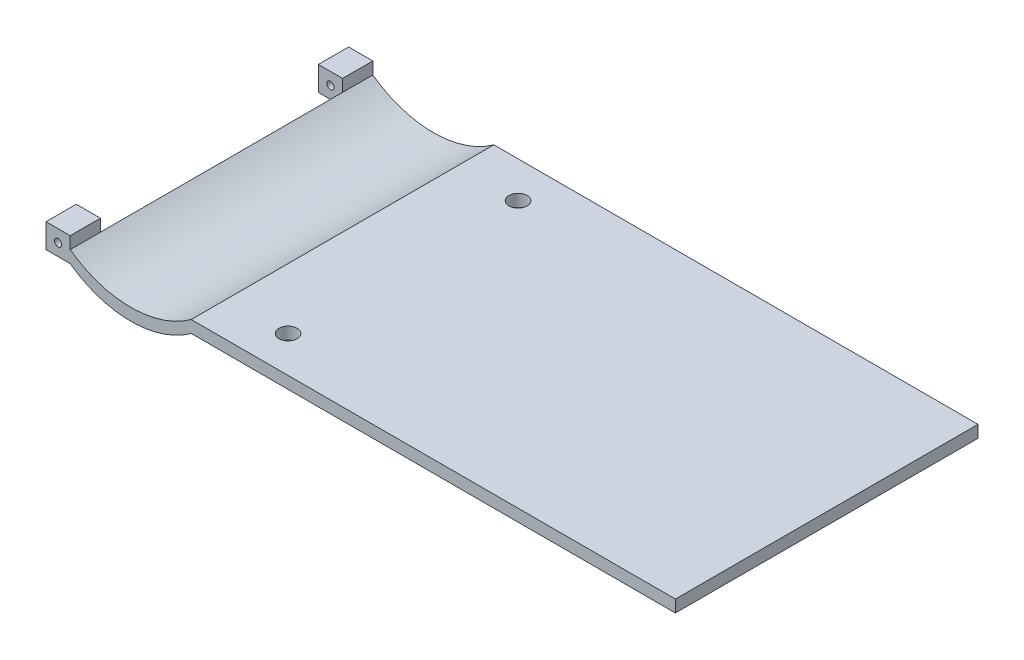
ISO-10303-21;
HEADER;
FILE_DESCRIPTION(('STEP AP214'),'2;1');
FILE_NAME('part.step','',(''),(''),'','','');
FILE_SCHEMA(('AUTOMOTIVE_DESIGN { 1 0 10303 214 1 1 1 1 }'));
ENDSEC;
DATA;
#1=APPLICATION_CONTEXT('core data for automotive mechanical design processes');
#2=APPLICATION_PROTOCOL_DEFINITION('international standard','automotive_design',2000,#1);
#3=PRODUCT_CONTEXT('',#1,'mechanical');
#4=PRODUCT('Part','Part','',(#3));
#5=PRODUCT_RELATED_PRODUCT_CATEGORY('part','',(#4));
#6=PRODUCT_DEFINITION_FORMATION('','',#4);
#7=PRODUCT_DEFINITION_CONTEXT('part definition',#1,'design');
#8=PRODUCT_DEFINITION('design','',#6,#7);
#9=PRODUCT_DEFINITION_SHAPE('','',#8);
#10=(LENGTH_UNIT() NAMED_UNIT(*) SI_UNIT(.MILLI.,.METRE.));
#11=(NAMED_UNIT(*) PLANE_ANGLE_UNIT() SI_UNIT($,.RADIAN.));
#12=(NAMED_UNIT(*) SI_UNIT($,.STERADIAN.) SOLID_ANGLE_UNIT());
#13=UNCERTAINTY_MEASURE_WITH_UNIT(LENGTH_MEASURE(1.E-05),#10,'distance_accuracy_value','');
#14=(GEOMETRIC_REPRESENTATION_CONTEXT(3) GLOBAL_UNCERTAINTY_ASSIGNED_CONTEXT((#13)) GLOBAL_UNIT_ASSIGNED_CONTEXT((#10,
#11,#12)) REPRESENTATION_CONTEXT('',''));
#15=CARTESIAN_POINT('',(0.,0.,0.));
#16=DIRECTION('',(0.,0.,1.));
#17=DIRECTION('',(1.,0.,0.));
#18=AXIS2_PLACEMENT_3D('',#15,#16,#17);
#19=CARTESIAN_POINT('',(-599.999999999995,-826.529608575885,500.));
#20=DIRECTION('',(-1.,0.,0.));
#21=DIRECTION('',(0.,-1.,0.));
#22=AXIS2_PLACEMENT_3D('',#19,#20,#21);
#23=PLANE('',#22);
#24=DIRECTION('',(0.,0.,-1.));
#25=VECTOR('',#24,1.);
#26=CARTESIAN_POINT('',(-600.,9.9999999999999,500.));
#27=LINE('',#26,#25);
#28=CARTESIAN_POINT('',(-600.,9.9999999999999,500.));
#29=VERTEX_POINT('',#28);
#30=CARTESIAN_POINT('',(-600.,9.9999999999999,450.));
#31=VERTEX_POINT('',#30);
#32=EDGE_CURVE('E42',#29,#31,#27,.T.);
#33=ORIENTED_EDGE('',*,*,#32,.T.);
#34=DIRECTION('',(0.,1.,0.));
#35=VECTOR('',#34,1.);
#36=CARTESIAN_POINT('',(-600.,-42.5227291513248,450.));
#37=LINE('',#36,#35);
#38=CARTESIAN_POINT('',(-600.,30.,450.));
#39=VERTEX_POINT('',#38);
#40=EDGE_CURVE('E214',#31,#39,#37,.T.);
#41=ORIENTED_EDGE('',*,*,#40,.T.);
#42=DIRECTION('',(0.,0.,-1.));
#43=VECTOR('',#42,1.);
#44=CARTESIAN_POINT('',(-600.,30.,500.));
#45=LINE('',#44,#43);
#46=CARTESIAN_POINT('',(-600.,30.,500.));
#47=VERTEX_POINT('',#46);
#48=EDGE_CURVE('E194',#47,#39,#45,.T.);
#49=ORIENTED_EDGE('',*,*,#48,.F.);
#50=DIRECTION('',(0.,1.,0.));
#51=VECTOR('',#50,1.);
#52=CARTESIAN_POINT('',(-599.999999999995,-826.529608575885,500.));
#53=LINE('',#52,#51);
#54=EDGE_CURVE('E245',#29,#47,#53,.T.);
#55=ORIENTED_EDGE('',*,*,#54,.F.);
#56=EDGE_LOOP('',(#33,#41,#49,#55));
#57=FACE_BOUND('',#56,.T.);
#58=ADVANCED_FACE('F33',(#57),#23,.F.);
#59=CARTESIAN_POINT('',(-129.99489689484,30.,500.));
#60=DIRECTION('',(0.,-1.,0.));
#61=DIRECTION('',(1.,0.,0.));
#62=AXIS2_PLACEMENT_3D('',#59,#60,#61);
#63=PLANE('',#62);
#64=ORIENTED_EDGE('',*,*,#48,.T.);
#65=DIRECTION('',(1.,0.,0.));
#66=VECTOR('',#65,1.);
#67=CARTESIAN_POINT('',(-600.,30.,450.));
#68=LINE('',#67,#66);
#69=CARTESIAN_POINT('',(-640.,30.,450.));
#70=VERTEX_POINT('',#69);
#71=EDGE_CURVE('E222',#70,#39,#68,.T.);
#72=ORIENTED_EDGE('',*,*,#71,.F.);
#73=DIRECTION('',(0.,0.,-1.));
#74=VECTOR('',#73,1.);
#75=CARTESIAN_POINT('',(-640.,30.,500.));
#76=LINE('',#75,#74);
#77=CARTESIAN_POINT('',(-640.,30.,500.));
#78=VERTEX_POINT('',#77);
#79=EDGE_CURVE('E190',#78,#70,#76,.T.);
#80=ORIENTED_EDGE('',*,*,#79,.F.);
#81=DIRECTION('',(-1.,0.,0.));
#82=VECTOR('',#81,1.);
#83=CARTESIAN_POINT('',(-129.99489689484,30.,500.));
#84=LINE('',#83,#82);
#85=EDGE_CURVE('E247',#47,#78,#84,.T.);
#86=ORIENTED_EDGE('',*,*,#85,.F.);
#87=EDGE_LOOP('',(#64,#72,#80,#86));
#88=FACE_BOUND('',#87,.T.);
#89=ADVANCED_FACE('F318',(#88),#63,.F.);
#90=CARTESIAN_POINT('',(-640.,-826.529608575883,500.));
#91=DIRECTION('',(-1.,0.,0.));
#92=DIRECTION('',(0.,0.,1.));
#93=AXIS2_PLACEMENT_3D('',#90,#91,#92);
#94=PLANE('',#93);
#95=DIRECTION('',(0.,1.,0.));
#96=VECTOR('',#95,1.);
#97=CARTESIAN_POINT('',(-640.,-42.5227291513248,450.));
#98=LINE('',#97,#96);
#99=CARTESIAN_POINT('',(-640.,-10.,450.));
#100=VERTEX_POINT('',#99);
#101=EDGE_CURVE('E219',#100,#70,#98,.T.);
#102=ORIENTED_EDGE('',*,*,#101,.F.);
#103=DIRECTION('',(0.,0.,-1.));
#104=VECTOR('',#103,1.);
#105=CARTESIAN_POINT('',(-640.,-10.,500.));
#106=LINE('',#105,#104);
#107=CARTESIAN_POINT('',(-640.,-10.,500.));
#108=VERTEX_POINT('',#107);
#109=EDGE_CURVE('E186',#108,#100,#106,.T.);
#110=ORIENTED_EDGE('',*,*,#109,.F.);
#111=DIRECTION('',(0.,1.,0.));
#112=VECTOR('',#111,1.);
#113=CARTESIAN_POINT('',(-640.,-826.529608575883,500.));
#114=LINE('',#113,#112);
#115=EDGE_CURVE('E249',#108,#78,#114,.T.);
#116=ORIENTED_EDGE('',*,*,#115,.T.);
#117=ORIENTED_EDGE('',*,*,#79,.T.);
#118=EDGE_LOOP('',(#102,#110,#116,#117));
#119=FACE_BOUND('',#118,.T.);
#120=ADVANCED_FACE('F324',(#119),#94,.T.);
#121=CARTESIAN_POINT('',(-129.99489689484,-10.,500.));
#122=DIRECTION('',(0.,-1.,0.));
#123=DIRECTION('',(1.,0.,0.));
#124=AXIS2_PLACEMENT_3D('',#121,#122,#123);
#125=PLANE('',#124);
#126=DIRECTION('',(-1.,0.,0.));
#127=VECTOR('',#126,1.);
#128=CARTESIAN_POINT('',(-129.99489689484,-10.,450.));
#129=LINE('',#128,#127);
#130=CARTESIAN_POINT('',(-600.,-9.99999999999976,450.));
#131=VERTEX_POINT('',#130);
#132=EDGE_CURVE('E232',#131,#100,#129,.T.);
#133=ORIENTED_EDGE('',*,*,#132,.F.);
#134=DIRECTION('',(0.,0.,-1.));
#135=VECTOR('',#134,1.);
#136=CARTESIAN_POINT('',(-600.,-10.,500.));
#137=LINE('',#136,#135);
#138=CARTESIAN_POINT('',(-600.,-10.,500.));
#139=VERTEX_POINT('',#138);
#140=EDGE_CURVE('E182',#139,#131,#137,.T.);
#141=ORIENTED_EDGE('',*,*,#140,.F.);
#142=DIRECTION('',(-1.,0.,0.));
#143=VECTOR('',#142,1.);
#144=CARTESIAN_POINT('',(-129.99489689484,-10.,500.));
#145=LINE('',#144,#143);
#146=EDGE_CURVE('E129',#139,#108,#145,.T.);
#147=ORIENTED_EDGE('',*,*,#146,.T.);
#148=ORIENTED_EDGE('',*,*,#109,.T.);
#149=EDGE_LOOP('',(#133,#141,#147,#148));
#150=FACE_BOUND('',#149,.T.);
#151=ADVANCED_FACE('F253',(#150),#125,.T.);
#152=CARTESIAN_POINT('',(-620.,9.99999999999993,500.));
#153=DIRECTION('',(0.,0.,-1.));
#154=DIRECTION('',(-1.,0.,0.));
#155=AXIS2_PLACEMENT_3D('',#152,#153,#154);
#156=CYLINDRICAL_SURFACE('',#155,5.99999999999999);
#157=CARTESIAN_POINT('',(-620.,9.99999999999993,450.));
#158=DIRECTION('',(0.,0.,1.));
#159=DIRECTION('',(1.,0.,0.));
#160=AXIS2_PLACEMENT_3D('',#157,#158,#159);
#161=CIRCLE('',#160,5.99999999999999);
#162=CARTESIAN_POINT('',(-614.,9.99999999999993,450.));
#163=VERTEX_POINT('',#162);
#164=EDGE_CURVE('E37',#163,#163,#161,.T.);
#165=ORIENTED_EDGE('',*,*,#164,.F.);
#166=EDGE_LOOP('',(#165));
#167=FACE_BOUND('',#166,.T.);
#168=CARTESIAN_POINT('',(-620.,9.99999999999993,500.));
#169=DIRECTION('',(0.,0.,1.));
#170=DIRECTION('',(1.,0.,0.));
#171=AXIS2_PLACEMENT_3D('',#168,#169,#170);
#172=CIRCLE('',#171,5.99999999999999);
#173=CARTESIAN_POINT('',(-614.,9.99999999999993,500.));
#174=VERTEX_POINT('',#173);
#175=EDGE_CURVE('E147',#174,#174,#172,.T.);
#176=ORIENTED_EDGE('',*,*,#175,.T.);
#177=EDGE_LOOP('',(#176));
#178=FACE_BOUND('',#177,.T.);
#179=ADVANCED_FACE('F314',(#167,#178),#156,.F.);
#180=CARTESIAN_POINT('',(-129.99489689484,9.9999999999999,500.));
#181=DIRECTION('',(0.,-1.,0.));
#182=DIRECTION('',(1.,0.,0.));
#183=AXIS2_PLACEMENT_3D('',#180,#181,#182);
#184=PLANE('',#183);
#185=CARTESIAN_POINT('',(-300.,9.99999999999988,60.));
#186=DIRECTION('',(0.,1.,0.));
#187=DIRECTION('',(-1.,0.,0.));
#188=AXIS2_PLACEMENT_3D('',#185,#186,#187);
#189=CIRCLE('',#188,15.);
#190=CARTESIAN_POINT('',(-315.,9.99999999999988,60.));
#191=VERTEX_POINT('',#190);
#192=EDGE_CURVE('E205',#191,#191,#189,.T.);
#193=ORIENTED_EDGE('',*,*,#192,.F.);
#194=EDGE_LOOP('',(#193));
#195=FACE_BOUND('',#194,.T.);
#196=DIRECTION('',(-1.,0.,0.));
#197=VECTOR('',#196,1.);
#198=CARTESIAN_POINT('',(-129.99489689484,9.9999999999999,0.));
#199=LINE('',#198,#197);
#200=CARTESIAN_POINT('',(400.,10.,0.));
#201=VERTEX_POINT('',#200);
#202=CARTESIAN_POINT('',(-400.,9.99999999999986,0.));
#203=VERTEX_POINT('',#202);
#204=EDGE_CURVE('E154',#201,#203,#199,.T.);
#205=ORIENTED_EDGE('',*,*,#204,.T.);
#206=DIRECTION('',(0.,0.,-1.));
#207=VECTOR('',#206,1.);
#208=CARTESIAN_POINT('',(-400.,9.99999999999986,500.));
#209=LINE('',#208,#207);
#210=CARTESIAN_POINT('',(-400.,9.99999999999986,500.));
#211=VERTEX_POINT('',#210);
#212=EDGE_CURVE('E11',#211,#203,#209,.T.);
#213=ORIENTED_EDGE('',*,*,#212,.F.);
#214=DIRECTION('',(-1.,0.,0.));
#215=VECTOR('',#214,1.);
#216=CARTESIAN_POINT('',(-129.99489689484,9.9999999999999,500.));
#217=LINE('',#216,#215);
#218=CARTESIAN_POINT('',(400.,10.,500.));
#219=VERTEX_POINT('',#218);
#220=EDGE_CURVE('E100',#219,#211,#217,.T.);
#221=ORIENTED_EDGE('',*,*,#220,.F.);
#222=DIRECTION('',(0.,0.,-1.));
#223=VECTOR('',#222,1.);
#224=CARTESIAN_POINT('',(400.,10.,500.));
#225=LINE('',#224,#223);
#226=EDGE_CURVE('E153',#219,#201,#225,.T.);
#227=ORIENTED_EDGE('',*,*,#226,.T.);
#228=EDGE_LOOP('',(#205,#213,#221,#227));
#229=FACE_BOUND('',#228,.T.);
#230=CARTESIAN_POINT('',(-300.,9.99999999999988,440.));
#231=DIRECTION('',(0.,1.,0.));
#232=DIRECTION('',(-1.,0.,0.));
#233=AXIS2_PLACEMENT_3D('',#230,#231,#232);
#234=CIRCLE('',#233,15.);
#235=CARTESIAN_POINT('',(-315.,9.99999999999988,440.));
#236=VERTEX_POINT('',#235);
#237=EDGE_CURVE('E202',#236,#236,#234,.F.);
#238=ORIENTED_EDGE('',*,*,#237,.T.);
#239=EDGE_LOOP('',(#238));
#240=FACE_BOUND('',#239,.T.);
#241=ADVANCED_FACE('F35',(#195,#229,#240),#184,.F.);
#242=CARTESIAN_POINT('',(-129.99489689484,-10.0000000000001,500.));
#243=DIRECTION('',(0.,-1.,0.));
#244=DIRECTION('',(1.,0.,0.));
#245=AXIS2_PLACEMENT_3D('',#242,#243,#244);
#246=PLANE('',#245);
#247=CARTESIAN_POINT('',(-300.,-10.0000000000001,60.));
#248=DIRECTION('',(0.,-1.,0.));
#249=DIRECTION('',(1.,0.,0.));
#250=AXIS2_PLACEMENT_3D('',#247,#248,#249);
#251=CIRCLE('',#250,15.);
#252=CARTESIAN_POINT('',(-285.,-10.0000000000001,60.));
#253=VERTEX_POINT('',#252);
#254=EDGE_CURVE('E203',#253,#253,#251,.T.);
#255=ORIENTED_EDGE('',*,*,#254,.F.);
#256=EDGE_LOOP('',(#255));
#257=FACE_BOUND('',#256,.T.);
#258=DIRECTION('',(-1.,0.,0.));
#259=VECTOR('',#258,1.);
#260=CARTESIAN_POINT('',(-129.99489689484,-10.0000000000001,0.));
#261=LINE('',#260,#259);
#262=CARTESIAN_POINT('',(400.,-10.0000000000001,0.));
#263=VERTEX_POINT('',#262);
#264=CARTESIAN_POINT('',(-400.,-10.0000000000002,0.));
#265=VERTEX_POINT('',#264);
#266=EDGE_CURVE('E174',#263,#265,#261,.T.);
#267=ORIENTED_EDGE('',*,*,#266,.F.);
#268=DIRECTION('',(0.,0.,-1.));
#269=VECTOR('',#268,1.);
#270=CARTESIAN_POINT('',(400.,-10.0000000000001,500.));
#271=LINE('',#270,#269);
#272=CARTESIAN_POINT('',(400.,-10.0000000000001,500.));
#273=VERTEX_POINT('',#272);
#274=EDGE_CURVE('E142',#273,#263,#271,.T.);
#275=ORIENTED_EDGE('',*,*,#274,.F.);
#276=DIRECTION('',(-1.,0.,0.));
#277=VECTOR('',#276,1.);
#278=CARTESIAN_POINT('',(-129.99489689484,-10.0000000000001,500.));
#279=LINE('',#278,#277);
#280=CARTESIAN_POINT('',(-400.,-10.0000000000002,500.));
#281=VERTEX_POINT('',#280);
#282=EDGE_CURVE('E126',#273,#281,#279,.T.);
#283=ORIENTED_EDGE('',*,*,#282,.T.);
#284=DIRECTION('',(0.,0.,-1.));
#285=VECTOR('',#284,1.);
#286=CARTESIAN_POINT('',(-400.,-10.0000000000002,500.));
#287=LINE('',#286,#285);
#288=EDGE_CURVE('E134',#281,#265,#287,.T.);
#289=ORIENTED_EDGE('',*,*,#288,.T.);
#290=EDGE_LOOP('',(#267,#275,#283,#289));
#291=FACE_BOUND('',#290,.T.);
#292=CARTESIAN_POINT('',(-300.,-10.0000000000001,440.));
#293=DIRECTION('',(0.,-1.,0.));
#294=DIRECTION('',(1.,0.,0.));
#295=AXIS2_PLACEMENT_3D('',#292,#293,#294);
#296=CIRCLE('',#295,15.);
#297=CARTESIAN_POINT('',(-285.,-10.0000000000001,440.));
#298=VERTEX_POINT('',#297);
#299=EDGE_CURVE('E158',#298,#298,#296,.F.);
#300=ORIENTED_EDGE('',*,*,#299,.T.);
#301=EDGE_LOOP('',(#300));
#302=FACE_BOUND('',#301,.T.);
#303=ADVANCED_FACE('F144',(#257,#291,#302),#246,.T.);
#304=CARTESIAN_POINT('',(-500.,147.477270848675,500.));
#305=DIRECTION('',(0.,0.,-1.));
#306=DIRECTION('',(-1.,0.,0.));
#307=AXIS2_PLACEMENT_3D('',#304,#305,#306);
#308=CYLINDRICAL_SURFACE('',#307,170.);
#309=CARTESIAN_POINT('',(-500.,147.477270848675,0.));
#310=DIRECTION('',(0.,0.,1.));
#311=DIRECTION('',(1.,0.,0.));
#312=AXIS2_PLACEMENT_3D('',#309,#310,#311);
#313=CIRCLE('',#312,170.);
#314=CARTESIAN_POINT('',(-600.,9.9999999999999,0.));
#315=VERTEX_POINT('',#314);
#316=EDGE_CURVE('E157',#315,#203,#313,.T.);
#317=ORIENTED_EDGE('',*,*,#316,.F.);
#318=CARTESIAN_POINT('',(-600.,9.9999999999999,50.));
#319=VERTEX_POINT('',#318);
#320=EDGE_CURVE('E197',#319,#315,#27,.T.);
#321=ORIENTED_EDGE('',*,*,#320,.F.);
#322=DIRECTION('',(0.,0.,-1.));
#323=VECTOR('',#322,1.);
#324=CARTESIAN_POINT('',(-600.,10.,500.));
#325=LINE('',#324,#323);
#326=EDGE_CURVE('E235',#31,#319,#325,.T.);
#327=ORIENTED_EDGE('',*,*,#326,.F.);
#328=ORIENTED_EDGE('',*,*,#32,.F.);
#329=CARTESIAN_POINT('',(-500.,147.477270848675,500.));
#330=DIRECTION('',(0.,0.,1.));
#331=DIRECTION('',(1.,0.,0.));
#332=AXIS2_PLACEMENT_3D('',#329,#330,#331);
#333=CIRCLE('',#332,170.);
#334=EDGE_CURVE('E242',#29,#211,#333,.T.);
#335=ORIENTED_EDGE('',*,*,#334,.T.);
#336=ORIENTED_EDGE('',*,*,#212,.T.);
#337=EDGE_LOOP('',(#317,#321,#327,#328,#335,#336));
#338=FACE_BOUND('',#337,.T.);
#339=ADVANCED_FACE('F328',(#338),#308,.F.);
#340=CARTESIAN_POINT('',(-600.,30.,50.));
#341=VERTEX_POINT('',#340);
#342=CARTESIAN_POINT('',(-600.,30.,0.));
#343=VERTEX_POINT('',#342);
#344=EDGE_CURVE('E193',#341,#343,#45,.T.);
#345=ORIENTED_EDGE('',*,*,#344,.F.);
#346=DIRECTION('',(0.,1.,0.));
#347=VECTOR('',#346,1.);
#348=CARTESIAN_POINT('',(-600.,-42.5227291513248,50.));
#349=LINE('',#348,#347);
#350=EDGE_CURVE('E229',#319,#341,#349,.T.);
#351=ORIENTED_EDGE('',*,*,#350,.F.);
#352=ORIENTED_EDGE('',*,*,#320,.T.);
#353=DIRECTION('',(0.,1.,0.));
#354=VECTOR('',#353,1.);
#355=CARTESIAN_POINT('',(-599.999999999995,-826.529608575885,0.));
#356=LINE('',#355,#354);
#357=EDGE_CURVE('E161',#315,#343,#356,.T.);
#358=ORIENTED_EDGE('',*,*,#357,.T.);
#359=EDGE_LOOP('',(#345,#351,#352,#358));
#360=FACE_BOUND('',#359,.T.);
#361=ADVANCED_FACE('F285',(#360),#23,.F.);
#362=CARTESIAN_POINT('',(-640.,30.,50.));
#363=VERTEX_POINT('',#362);
#364=CARTESIAN_POINT('',(-640.,30.,0.));
#365=VERTEX_POINT('',#364);
#366=EDGE_CURVE('E189',#363,#365,#76,.T.);
#367=ORIENTED_EDGE('',*,*,#366,.F.);
#368=DIRECTION('',(-1.,0.,0.));
#369=VECTOR('',#368,1.);
#370=CARTESIAN_POINT('',(-600.,30.,50.));
#371=LINE('',#370,#369);
#372=EDGE_CURVE('E278',#341,#363,#371,.T.);
#373=ORIENTED_EDGE('',*,*,#372,.F.);
#374=ORIENTED_EDGE('',*,*,#344,.T.);
#375=DIRECTION('',(-1.,0.,0.));
#376=VECTOR('',#375,1.);
#377=CARTESIAN_POINT('',(-129.99489689484,30.,0.));
#378=LINE('',#377,#376);
#379=EDGE_CURVE('E164',#343,#365,#378,.T.);
#380=ORIENTED_EDGE('',*,*,#379,.T.);
#381=EDGE_LOOP('',(#367,#373,#374,#380));
#382=FACE_BOUND('',#381,.T.);
#383=ADVANCED_FACE('F284',(#382),#63,.F.);
#384=DIRECTION('',(0.,1.,0.));
#385=VECTOR('',#384,1.);
#386=CARTESIAN_POINT('',(-640.,-42.5227291513248,50.));
#387=LINE('',#386,#385);
#388=CARTESIAN_POINT('',(-640.,-10.,50.));
#389=VERTEX_POINT('',#388);
#390=EDGE_CURVE('E226',#389,#363,#387,.T.);
#391=ORIENTED_EDGE('',*,*,#390,.T.);
#392=ORIENTED_EDGE('',*,*,#366,.T.);
#393=DIRECTION('',(0.,1.,0.));
#394=VECTOR('',#393,1.);
#395=CARTESIAN_POINT('',(-640.,-826.529608575883,0.));
#396=LINE('',#395,#394);
#397=CARTESIAN_POINT('',(-640.,-10.,0.));
#398=VERTEX_POINT('',#397);
#399=EDGE_CURVE('E167',#398,#365,#396,.T.);
#400=ORIENTED_EDGE('',*,*,#399,.F.);
#401=EDGE_CURVE('E184',#389,#398,#106,.T.);
#402=ORIENTED_EDGE('',*,*,#401,.F.);
#403=EDGE_LOOP('',(#391,#392,#400,#402));
#404=FACE_BOUND('',#403,.T.);
#405=ADVANCED_FACE('F297',(#404),#94,.T.);
#406=DIRECTION('',(1.,0.,0.));
#407=VECTOR('',#406,1.);
#408=CARTESIAN_POINT('',(-129.994896894841,-10.,49.9999999999998));
#409=LINE('',#408,#407);
#410=CARTESIAN_POINT('',(-600.,-10.,50.));
#411=VERTEX_POINT('',#410);
#412=EDGE_CURVE('E208',#389,#411,#409,.T.);
#413=ORIENTED_EDGE('',*,*,#412,.F.);
#414=ORIENTED_EDGE('',*,*,#401,.T.);
#415=DIRECTION('',(-1.,0.,0.));
#416=VECTOR('',#415,1.);
#417=CARTESIAN_POINT('',(-129.99489689484,-10.,0.));
#418=LINE('',#417,#416);
#419=CARTESIAN_POINT('',(-600.,-10.,0.));
#420=VERTEX_POINT('',#419);
#421=EDGE_CURVE('E170',#420,#398,#418,.T.);
#422=ORIENTED_EDGE('',*,*,#421,.F.);
#423=EDGE_CURVE('E141',#411,#420,#137,.T.);
#424=ORIENTED_EDGE('',*,*,#423,.F.);
#425=EDGE_LOOP('',(#413,#414,#422,#424));
#426=FACE_BOUND('',#425,.T.);
#427=ADVANCED_FACE('F301',(#426),#125,.T.);
#428=CARTESIAN_POINT('',(-500.,127.477270848675,500.));
#429=DIRECTION('',(0.,0.,-1.));
#430=DIRECTION('',(-1.,0.,0.));
#431=AXIS2_PLACEMENT_3D('',#428,#429,#430);
#432=CYLINDRICAL_SURFACE('',#431,170.);
#433=CARTESIAN_POINT('',(-500.,127.477270848675,0.));
#434=DIRECTION('',(0.,0.,1.));
#435=DIRECTION('',(1.,0.,0.));
#436=AXIS2_PLACEMENT_3D('',#433,#434,#435);
#437=CIRCLE('',#436,170.);
#438=EDGE_CURVE('E137',#420,#265,#437,.T.);
#439=ORIENTED_EDGE('',*,*,#438,.T.);
#440=ORIENTED_EDGE('',*,*,#288,.F.);
#441=CARTESIAN_POINT('',(-500.,127.477270848675,500.));
#442=DIRECTION('',(0.,0.,1.));
#443=DIRECTION('',(1.,0.,0.));
#444=AXIS2_PLACEMENT_3D('',#441,#442,#443);
#445=CIRCLE('',#444,170.);
#446=EDGE_CURVE('E121',#139,#281,#445,.T.);
#447=ORIENTED_EDGE('',*,*,#446,.F.);
#448=ORIENTED_EDGE('',*,*,#140,.T.);
#449=EDGE_CURVE('E185',#131,#411,#137,.T.);
#450=ORIENTED_EDGE('',*,*,#449,.T.);
#451=ORIENTED_EDGE('',*,*,#423,.T.);
#452=EDGE_LOOP('',(#439,#440,#447,#448,#450,#451));
#453=FACE_BOUND('',#452,.T.);
#454=ADVANCED_FACE('F135',(#453),#432,.T.);
#455=CARTESIAN_POINT('',(400.,-826.529608575883,500.));
#456=DIRECTION('',(-1.,0.,0.));
#457=DIRECTION('',(0.,0.,1.));
#458=AXIS2_PLACEMENT_3D('',#455,#456,#457);
#459=PLANE('',#458);
#460=DIRECTION('',(0.,1.,0.));
#461=VECTOR('',#460,1.);
#462=CARTESIAN_POINT('',(400.,-826.529608575883,0.));
#463=LINE('',#462,#461);
#464=EDGE_CURVE('E94',#263,#201,#463,.T.);
#465=ORIENTED_EDGE('',*,*,#464,.T.);
#466=ORIENTED_EDGE('',*,*,#226,.F.);
#467=DIRECTION('',(0.,1.,0.));
#468=VECTOR('',#467,1.);
#469=CARTESIAN_POINT('',(400.,-826.529608575883,500.));
#470=LINE('',#469,#468);
#471=EDGE_CURVE('E59',#273,#219,#470,.T.);
#472=ORIENTED_EDGE('',*,*,#471,.F.);
#473=ORIENTED_EDGE('',*,*,#274,.T.);
#474=EDGE_LOOP('',(#465,#466,#472,#473));
#475=FACE_BOUND('',#474,.T.);
#476=ADVANCED_FACE('F304',(#475),#459,.F.);
#477=CARTESIAN_POINT('',(-620.,9.99999999999993,50.));
#478=DIRECTION('',(0.,0.,-1.));
#479=DIRECTION('',(-1.,0.,0.));
#480=AXIS2_PLACEMENT_3D('',#477,#478,#479);
#481=CIRCLE('',#480,5.99999999999999);
#482=CARTESIAN_POINT('',(-626.,9.99999999999993,50.));
#483=VERTEX_POINT('',#482);
#484=EDGE_CURVE('E206',#483,#483,#481,.T.);
#485=ORIENTED_EDGE('',*,*,#484,.F.);
#486=EDGE_LOOP('',(#485));
#487=FACE_BOUND('',#486,.T.);
#488=CARTESIAN_POINT('',(-620.,9.99999999999993,0.));
#489=DIRECTION('',(0.,0.,1.));
#490=DIRECTION('',(1.,0.,0.));
#491=AXIS2_PLACEMENT_3D('',#488,#489,#490);
#492=CIRCLE('',#491,5.99999999999999);
#493=CARTESIAN_POINT('',(-614.,9.99999999999993,0.));
#494=VERTEX_POINT('',#493);
#495=EDGE_CURVE('E177',#494,#494,#492,.T.);
#496=ORIENTED_EDGE('',*,*,#495,.F.);
#497=EDGE_LOOP('',(#496));
#498=FACE_BOUND('',#497,.T.);
#499=ADVANCED_FACE('F306',(#487,#498),#156,.F.);
#500=CARTESIAN_POINT('',(-129.99489689484,-826.529608575883,500.));
#501=DIRECTION('',(0.,0.,1.));
#502=DIRECTION('',(1.,0.,0.));
#503=AXIS2_PLACEMENT_3D('',#500,#501,#502);
#504=PLANE('',#503);
#505=ORIENTED_EDGE('',*,*,#220,.T.);
#506=ORIENTED_EDGE('',*,*,#334,.F.);
#507=ORIENTED_EDGE('',*,*,#54,.T.);
#508=ORIENTED_EDGE('',*,*,#85,.T.);
#509=ORIENTED_EDGE('',*,*,#115,.F.);
#510=ORIENTED_EDGE('',*,*,#146,.F.);
#511=ORIENTED_EDGE('',*,*,#446,.T.);
#512=ORIENTED_EDGE('',*,*,#282,.F.);
#513=ORIENTED_EDGE('',*,*,#471,.T.);
#514=EDGE_LOOP('',(#505,#506,#507,#508,#509,#510,#511,#512,#513));
#515=FACE_BOUND('',#514,.T.);
#516=ORIENTED_EDGE('',*,*,#175,.F.);
#517=EDGE_LOOP('',(#516));
#518=FACE_BOUND('',#517,.T.);
#519=ADVANCED_FACE('F123',(#515,#518),#504,.T.);
#520=CARTESIAN_POINT('',(-129.99489689484,-826.529608575883,0.));
#521=DIRECTION('',(0.,0.,1.));
#522=DIRECTION('',(1.,0.,0.));
#523=AXIS2_PLACEMENT_3D('',#520,#521,#522);
#524=PLANE('',#523);
#525=ORIENTED_EDGE('',*,*,#204,.F.);
#526=ORIENTED_EDGE('',*,*,#464,.F.);
#527=ORIENTED_EDGE('',*,*,#266,.T.);
#528=ORIENTED_EDGE('',*,*,#438,.F.);
#529=ORIENTED_EDGE('',*,*,#421,.T.);
#530=ORIENTED_EDGE('',*,*,#399,.T.);
#531=ORIENTED_EDGE('',*,*,#379,.F.);
#532=ORIENTED_EDGE('',*,*,#357,.F.);
#533=ORIENTED_EDGE('',*,*,#316,.T.);
#534=EDGE_LOOP('',(#525,#526,#527,#528,#529,#530,#531,#532,#533));
#535=FACE_BOUND('',#534,.T.);
#536=ORIENTED_EDGE('',*,*,#495,.T.);
#537=EDGE_LOOP('',(#536));
#538=FACE_BOUND('',#537,.T.);
#539=ADVANCED_FACE('F291',(#535,#538),#524,.F.);
#540=CARTESIAN_POINT('',(-300.,-42.5227291513248,440.));
#541=DIRECTION('',(0.,1.,0.));
#542=DIRECTION('',(-1.,0.,0.));
#543=AXIS2_PLACEMENT_3D('',#540,#541,#542);
#544=CYLINDRICAL_SURFACE('',#543,15.);
#545=ORIENTED_EDGE('',*,*,#299,.F.);
#546=EDGE_LOOP('',(#545));
#547=FACE_BOUND('',#546,.T.);
#548=ORIENTED_EDGE('',*,*,#237,.F.);
#549=EDGE_LOOP('',(#548));
#550=FACE_BOUND('',#549,.T.);
#551=ADVANCED_FACE('F362',(#547,#550),#544,.F.);
#552=CARTESIAN_POINT('',(-300.,-42.5227291513248,60.));
#553=DIRECTION('',(0.,1.,0.));
#554=DIRECTION('',(-1.,0.,0.));
#555=AXIS2_PLACEMENT_3D('',#552,#553,#554);
#556=CYLINDRICAL_SURFACE('',#555,15.);
#557=ORIENTED_EDGE('',*,*,#254,.T.);
#558=EDGE_LOOP('',(#557));
#559=FACE_BOUND('',#558,.T.);
#560=ORIENTED_EDGE('',*,*,#192,.T.);
#561=EDGE_LOOP('',(#560));
#562=FACE_BOUND('',#561,.T.);
#563=ADVANCED_FACE('F367',(#559,#562),#556,.F.);
#564=CARTESIAN_POINT('',(-600.,-42.5227291513248,50.));
#565=DIRECTION('',(1.,0.,0.));
#566=DIRECTION('',(0.,0.,-1.));
#567=AXIS2_PLACEMENT_3D('',#564,#565,#566);
#568=PLANE('',#567);
#569=ORIENTED_EDGE('',*,*,#326,.T.);
#570=EDGE_CURVE('E50',#411,#319,#349,.T.);
#571=ORIENTED_EDGE('',*,*,#570,.F.);
#572=ORIENTED_EDGE('',*,*,#449,.F.);
#573=EDGE_CURVE('E209',#131,#31,#37,.T.);
#574=ORIENTED_EDGE('',*,*,#573,.T.);
#575=EDGE_LOOP('',(#569,#571,#572,#574));
#576=FACE_BOUND('',#575,.T.);
#577=ADVANCED_FACE('F349',(#576),#568,.F.);
#578=CARTESIAN_POINT('',(-600.,-42.5227291513248,450.));
#579=DIRECTION('',(0.,0.,1.));
#580=DIRECTION('',(1.,0.,0.));
#581=AXIS2_PLACEMENT_3D('',#578,#579,#580);
#582=PLANE('',#581);
#583=ORIENTED_EDGE('',*,*,#132,.T.);
#584=ORIENTED_EDGE('',*,*,#101,.T.);
#585=ORIENTED_EDGE('',*,*,#71,.T.);
#586=ORIENTED_EDGE('',*,*,#40,.F.);
#587=ORIENTED_EDGE('',*,*,#573,.F.);
#588=EDGE_LOOP('',(#583,#584,#585,#586,#587));
#589=FACE_BOUND('',#588,.T.);
#590=ORIENTED_EDGE('',*,*,#164,.T.);
#591=EDGE_LOOP('',(#590));
#592=FACE_BOUND('',#591,.T.);
#593=ADVANCED_FACE('F346',(#589,#592),#582,.F.);
#594=CARTESIAN_POINT('',(-600.,-42.5227291513248,50.));
#595=DIRECTION('',(0.,0.,-1.));
#596=DIRECTION('',(-1.,0.,0.));
#597=AXIS2_PLACEMENT_3D('',#594,#595,#596);
#598=PLANE('',#597);
#599=ORIENTED_EDGE('',*,*,#412,.T.);
#600=ORIENTED_EDGE('',*,*,#570,.T.);
#601=ORIENTED_EDGE('',*,*,#350,.T.);
#602=ORIENTED_EDGE('',*,*,#372,.T.);
#603=ORIENTED_EDGE('',*,*,#390,.F.);
#604=EDGE_LOOP('',(#599,#600,#601,#602,#603));
#605=FACE_BOUND('',#604,.T.);
#606=ORIENTED_EDGE('',*,*,#484,.T.);
#607=EDGE_LOOP('',(#606));
#608=FACE_BOUND('',#607,.T.);
#609=ADVANCED_FACE('F277',(#605,#608),#598,.F.);
#610=CLOSED_SHELL('',(#58,#89,#120,#151,#179,#241,#303,#339,#361,#383,#405,#427,#454,#476,#499,
#519,#539,#551,#563,#577,#593,#609));
#611=MANIFOLD_SOLID_BREP('B2',#610);
#612=ADVANCED_BREP_SHAPE_REPRESENTATION('',(#18,#611),#14);
#613=SHAPE_DEFINITION_REPRESENTATION(#9,#612);
ENDSEC;
END-ISO-10303-21;
